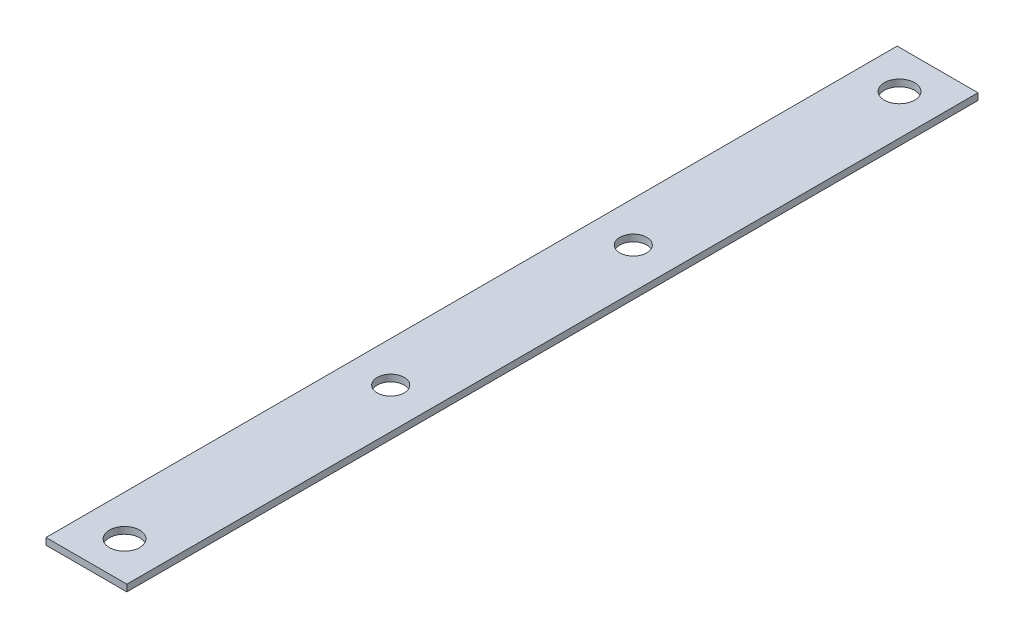
ISO-10303-21;
HEADER;
FILE_DESCRIPTION(('STEP AP214'),'2;1');
FILE_NAME('part.step','',(''),(''),'','','');
FILE_SCHEMA(('AUTOMOTIVE_DESIGN { 1 0 10303 214 1 1 1 1 }'));
ENDSEC;
DATA;
#1=APPLICATION_CONTEXT('core data for automotive mechanical design processes');
#2=APPLICATION_PROTOCOL_DEFINITION('international standard','automotive_design',2000,#1);
#3=PRODUCT_CONTEXT('',#1,'mechanical');
#4=PRODUCT('Part','Part','',(#3));
#5=PRODUCT_RELATED_PRODUCT_CATEGORY('part','',(#4));
#6=PRODUCT_DEFINITION_FORMATION('','',#4);
#7=PRODUCT_DEFINITION_CONTEXT('part definition',#1,'design');
#8=PRODUCT_DEFINITION('design','',#6,#7);
#9=PRODUCT_DEFINITION_SHAPE('','',#8);
#10=(LENGTH_UNIT() NAMED_UNIT(*) SI_UNIT(.MILLI.,.METRE.));
#11=(NAMED_UNIT(*) PLANE_ANGLE_UNIT() SI_UNIT($,.RADIAN.));
#12=(NAMED_UNIT(*) SI_UNIT($,.STERADIAN.) SOLID_ANGLE_UNIT());
#13=UNCERTAINTY_MEASURE_WITH_UNIT(LENGTH_MEASURE(1.E-05),#10,'distance_accuracy_value','');
#14=(GEOMETRIC_REPRESENTATION_CONTEXT(3) GLOBAL_UNCERTAINTY_ASSIGNED_CONTEXT((#13)) GLOBAL_UNIT_ASSIGNED_CONTEXT((#10,
#11,#12)) REPRESENTATION_CONTEXT('',''));
#15=CARTESIAN_POINT('',(0.,0.,0.));
#16=DIRECTION('',(0.,0.,1.));
#17=DIRECTION('',(1.,0.,0.));
#18=AXIS2_PLACEMENT_3D('',#15,#16,#17);
#19=CARTESIAN_POINT('',(0.,0.,401.0152));
#20=DIRECTION('',(1.,0.,0.));
#21=DIRECTION('',(0.,0.,-1.));
#22=AXIS2_PLACEMENT_3D('',#19,#20,#21);
#23=PLANE('',#22);
#24=DIRECTION('',(0.,-1.,0.));
#25=VECTOR('',#24,1.);
#26=CARTESIAN_POINT('',(0.,0.,0.));
#27=LINE('',#26,#25);
#28=CARTESIAN_POINT('',(0.,3.175,0.));
#29=VERTEX_POINT('',#28);
#30=CARTESIAN_POINT('',(0.,0.,0.));
#31=VERTEX_POINT('',#30);
#32=EDGE_CURVE('E95',#29,#31,#27,.T.);
#33=ORIENTED_EDGE('',*,*,#32,.T.);
#34=DIRECTION('',(0.,0.,-1.));
#35=VECTOR('',#34,1.);
#36=CARTESIAN_POINT('',(0.,0.,401.0152));
#37=LINE('',#36,#35);
#38=CARTESIAN_POINT('',(0.,0.,401.0152));
#39=VERTEX_POINT('',#38);
#40=EDGE_CURVE('E11',#39,#31,#37,.T.);
#41=ORIENTED_EDGE('',*,*,#40,.F.);
#42=DIRECTION('',(0.,-1.,0.));
#43=VECTOR('',#42,1.);
#44=CARTESIAN_POINT('',(0.,0.,401.0152));
#45=LINE('',#44,#43);
#46=CARTESIAN_POINT('',(0.,3.175,401.0152));
#47=VERTEX_POINT('',#46);
#48=EDGE_CURVE('E83',#47,#39,#45,.T.);
#49=ORIENTED_EDGE('',*,*,#48,.F.);
#50=DIRECTION('',(0.,0.,-1.));
#51=VECTOR('',#50,1.);
#52=CARTESIAN_POINT('',(0.,3.175,401.0152));
#53=LINE('',#52,#51);
#54=EDGE_CURVE('E91',#47,#29,#53,.T.);
#55=ORIENTED_EDGE('',*,*,#54,.T.);
#56=EDGE_LOOP('',(#33,#41,#49,#55));
#57=FACE_BOUND('',#56,.T.);
#58=ADVANCED_FACE('F32',(#57),#23,.F.);
#59=CARTESIAN_POINT('',(0.,0.,401.0152));
#60=DIRECTION('',(0.,1.,0.));
#61=DIRECTION('',(0.,0.,1.));
#62=AXIS2_PLACEMENT_3D('',#59,#60,#61);
#63=PLANE('',#62);
#64=CARTESIAN_POINT('',(19.05,0.,143.3576));
#65=DIRECTION('',(0.,1.,0.));
#66=DIRECTION('',(0.,0.,1.));
#67=AXIS2_PLACEMENT_3D('',#64,#65,#66);
#68=CIRCLE('',#67,6.34999999999998);
#69=CARTESIAN_POINT('',(19.05,0.,149.7076));
#70=VERTEX_POINT('',#69);
#71=EDGE_CURVE('E124',#70,#70,#68,.T.);
#72=ORIENTED_EDGE('',*,*,#71,.T.);
#73=EDGE_LOOP('',(#72));
#74=FACE_BOUND('',#73,.T.);
#75=CARTESIAN_POINT('',(19.05,0.,257.6576));
#76=DIRECTION('',(0.,1.,0.));
#77=DIRECTION('',(0.,0.,1.));
#78=AXIS2_PLACEMENT_3D('',#75,#76,#77);
#79=CIRCLE('',#78,6.35);
#80=CARTESIAN_POINT('',(19.05,0.,264.0076));
#81=VERTEX_POINT('',#80);
#82=EDGE_CURVE('E118',#81,#81,#79,.T.);
#83=ORIENTED_EDGE('',*,*,#82,.T.);
#84=EDGE_LOOP('',(#83));
#85=FACE_BOUND('',#84,.T.);
#86=CARTESIAN_POINT('',(19.05,0.,17.9451));
#87=DIRECTION('',(0.,1.,0.));
#88=DIRECTION('',(0.,0.,1.));
#89=AXIS2_PLACEMENT_3D('',#86,#87,#88);
#90=CIRCLE('',#89,7.14375);
#91=CARTESIAN_POINT('',(19.05,0.,25.08885));
#92=VERTEX_POINT('',#91);
#93=EDGE_CURVE('E112',#92,#92,#90,.T.);
#94=ORIENTED_EDGE('',*,*,#93,.T.);
#95=EDGE_LOOP('',(#94));
#96=FACE_BOUND('',#95,.T.);
#97=CARTESIAN_POINT('',(19.05,0.,383.0701));
#98=DIRECTION('',(0.,1.,0.));
#99=DIRECTION('',(0.,0.,1.));
#100=AXIS2_PLACEMENT_3D('',#97,#98,#99);
#101=CIRCLE('',#100,7.14375000000003);
#102=CARTESIAN_POINT('',(19.05,0.,390.21385));
#103=VERTEX_POINT('',#102);
#104=EDGE_CURVE('E98',#103,#103,#101,.T.);
#105=ORIENTED_EDGE('',*,*,#104,.T.);
#106=EDGE_LOOP('',(#105));
#107=FACE_BOUND('',#106,.T.);
#108=DIRECTION('',(1.,0.,0.));
#109=VECTOR('',#108,1.);
#110=CARTESIAN_POINT('',(0.,0.,0.));
#111=LINE('',#110,#109);
#112=CARTESIAN_POINT('',(38.1,0.,0.));
#113=VERTEX_POINT('',#112);
#114=EDGE_CURVE('E87',#31,#113,#111,.T.);
#115=ORIENTED_EDGE('',*,*,#114,.T.);
#116=DIRECTION('',(0.,0.,-1.));
#117=VECTOR('',#116,1.);
#118=CARTESIAN_POINT('',(38.1,0.,401.0152));
#119=LINE('',#118,#117);
#120=CARTESIAN_POINT('',(38.1,0.,401.0152));
#121=VERTEX_POINT('',#120);
#122=EDGE_CURVE('E40',#121,#113,#119,.T.);
#123=ORIENTED_EDGE('',*,*,#122,.F.);
#124=DIRECTION('',(1.,0.,0.));
#125=VECTOR('',#124,1.);
#126=CARTESIAN_POINT('',(0.,0.,401.0152));
#127=LINE('',#126,#125);
#128=EDGE_CURVE('E78',#39,#121,#127,.T.);
#129=ORIENTED_EDGE('',*,*,#128,.F.);
#130=ORIENTED_EDGE('',*,*,#40,.T.);
#131=EDGE_LOOP('',(#115,#123,#129,#130));
#132=FACE_BOUND('',#131,.T.);
#133=ADVANCED_FACE('F86',(#74,#85,#96,#107,#132),#63,.F.);
#134=CARTESIAN_POINT('',(38.1,0.,401.0152));
#135=DIRECTION('',(-1.,0.,0.));
#136=DIRECTION('',(0.,0.,1.));
#137=AXIS2_PLACEMENT_3D('',#134,#135,#136);
#138=PLANE('',#137);
#139=DIRECTION('',(0.,1.,0.));
#140=VECTOR('',#139,1.);
#141=CARTESIAN_POINT('',(38.1,0.,0.));
#142=LINE('',#141,#140);
#143=CARTESIAN_POINT('',(38.1,3.175,0.));
#144=VERTEX_POINT('',#143);
#145=EDGE_CURVE('E65',#113,#144,#142,.T.);
#146=ORIENTED_EDGE('',*,*,#145,.T.);
#147=DIRECTION('',(0.,0.,-1.));
#148=VECTOR('',#147,1.);
#149=CARTESIAN_POINT('',(38.1,3.175,401.0152));
#150=LINE('',#149,#148);
#151=CARTESIAN_POINT('',(38.1,3.175,401.0152));
#152=VERTEX_POINT('',#151);
#153=EDGE_CURVE('E88',#152,#144,#150,.T.);
#154=ORIENTED_EDGE('',*,*,#153,.F.);
#155=DIRECTION('',(0.,1.,0.));
#156=VECTOR('',#155,1.);
#157=CARTESIAN_POINT('',(38.1,0.,401.0152));
#158=LINE('',#157,#156);
#159=EDGE_CURVE('E81',#121,#152,#158,.T.);
#160=ORIENTED_EDGE('',*,*,#159,.F.);
#161=ORIENTED_EDGE('',*,*,#122,.T.);
#162=EDGE_LOOP('',(#146,#154,#160,#161));
#163=FACE_BOUND('',#162,.T.);
#164=ADVANCED_FACE('F89',(#163),#138,.F.);
#165=CARTESIAN_POINT('',(0.,3.175,401.0152));
#166=DIRECTION('',(0.,-1.,0.));
#167=DIRECTION('',(0.,0.,-1.));
#168=AXIS2_PLACEMENT_3D('',#165,#166,#167);
#169=PLANE('',#168);
#170=CARTESIAN_POINT('',(19.05,3.175,143.3576));
#171=DIRECTION('',(0.,1.,0.));
#172=DIRECTION('',(0.,0.,1.));
#173=AXIS2_PLACEMENT_3D('',#170,#171,#172);
#174=CIRCLE('',#173,6.34999999999998);
#175=CARTESIAN_POINT('',(19.05,3.175,149.7076));
#176=VERTEX_POINT('',#175);
#177=EDGE_CURVE('E127',#176,#176,#174,.T.);
#178=ORIENTED_EDGE('',*,*,#177,.F.);
#179=EDGE_LOOP('',(#178));
#180=FACE_BOUND('',#179,.T.);
#181=CARTESIAN_POINT('',(19.05,3.175,257.6576));
#182=DIRECTION('',(0.,1.,0.));
#183=DIRECTION('',(0.,0.,1.));
#184=AXIS2_PLACEMENT_3D('',#181,#182,#183);
#185=CIRCLE('',#184,6.35);
#186=CARTESIAN_POINT('',(19.05,3.175,264.0076));
#187=VERTEX_POINT('',#186);
#188=EDGE_CURVE('E121',#187,#187,#185,.T.);
#189=ORIENTED_EDGE('',*,*,#188,.F.);
#190=EDGE_LOOP('',(#189));
#191=FACE_BOUND('',#190,.T.);
#192=CARTESIAN_POINT('',(19.05,3.175,17.9451));
#193=DIRECTION('',(0.,1.,0.));
#194=DIRECTION('',(0.,0.,1.));
#195=AXIS2_PLACEMENT_3D('',#192,#193,#194);
#196=CIRCLE('',#195,7.14375);
#197=CARTESIAN_POINT('',(19.05,3.175,25.08885));
#198=VERTEX_POINT('',#197);
#199=EDGE_CURVE('E115',#198,#198,#196,.T.);
#200=ORIENTED_EDGE('',*,*,#199,.F.);
#201=EDGE_LOOP('',(#200));
#202=FACE_BOUND('',#201,.T.);
#203=CARTESIAN_POINT('',(19.05,3.175,383.0701));
#204=DIRECTION('',(0.,1.,0.));
#205=DIRECTION('',(0.,0.,1.));
#206=AXIS2_PLACEMENT_3D('',#203,#204,#205);
#207=CIRCLE('',#206,7.14375000000003);
#208=CARTESIAN_POINT('',(19.05,3.175,390.21385));
#209=VERTEX_POINT('',#208);
#210=EDGE_CURVE('E109',#209,#209,#207,.T.);
#211=ORIENTED_EDGE('',*,*,#210,.F.);
#212=EDGE_LOOP('',(#211));
#213=FACE_BOUND('',#212,.T.);
#214=DIRECTION('',(-1.,0.,0.));
#215=VECTOR('',#214,1.);
#216=CARTESIAN_POINT('',(0.,3.175,0.));
#217=LINE('',#216,#215);
#218=EDGE_CURVE('E71',#144,#29,#217,.T.);
#219=ORIENTED_EDGE('',*,*,#218,.T.);
#220=ORIENTED_EDGE('',*,*,#54,.F.);
#221=DIRECTION('',(-1.,0.,0.));
#222=VECTOR('',#221,1.);
#223=CARTESIAN_POINT('',(0.,3.175,401.0152));
#224=LINE('',#223,#222);
#225=EDGE_CURVE('E48',#152,#47,#224,.T.);
#226=ORIENTED_EDGE('',*,*,#225,.F.);
#227=ORIENTED_EDGE('',*,*,#153,.T.);
#228=EDGE_LOOP('',(#219,#220,#226,#227));
#229=FACE_BOUND('',#228,.T.);
#230=ADVANCED_FACE('F103',(#180,#191,#202,#213,#229),#169,.F.);
#231=CARTESIAN_POINT('',(0.,0.,401.0152));
#232=DIRECTION('',(0.,0.,-1.));
#233=DIRECTION('',(-1.,0.,0.));
#234=AXIS2_PLACEMENT_3D('',#231,#232,#233);
#235=PLANE('',#234);
#236=ORIENTED_EDGE('',*,*,#48,.T.);
#237=ORIENTED_EDGE('',*,*,#128,.T.);
#238=ORIENTED_EDGE('',*,*,#159,.T.);
#239=ORIENTED_EDGE('',*,*,#225,.T.);
#240=EDGE_LOOP('',(#236,#237,#238,#239));
#241=FACE_BOUND('',#240,.T.);
#242=ADVANCED_FACE('F79',(#241),#235,.F.);
#243=CARTESIAN_POINT('',(0.,0.,0.));
#244=DIRECTION('',(0.,0.,-1.));
#245=DIRECTION('',(-1.,0.,0.));
#246=AXIS2_PLACEMENT_3D('',#243,#244,#245);
#247=PLANE('',#246);
#248=ORIENTED_EDGE('',*,*,#32,.F.);
#249=ORIENTED_EDGE('',*,*,#218,.F.);
#250=ORIENTED_EDGE('',*,*,#145,.F.);
#251=ORIENTED_EDGE('',*,*,#114,.F.);
#252=EDGE_LOOP('',(#248,#249,#250,#251));
#253=FACE_BOUND('',#252,.T.);
#254=ADVANCED_FACE('F106',(#253),#247,.T.);
#255=CARTESIAN_POINT('',(19.05,0.,383.0701));
#256=DIRECTION('',(0.,1.,0.));
#257=DIRECTION('',(0.,0.,1.));
#258=AXIS2_PLACEMENT_3D('',#255,#256,#257);
#259=CYLINDRICAL_SURFACE('',#258,7.14375000000003);
#260=ORIENTED_EDGE('',*,*,#104,.F.);
#261=EDGE_LOOP('',(#260));
#262=FACE_BOUND('',#261,.T.);
#263=ORIENTED_EDGE('',*,*,#210,.T.);
#264=EDGE_LOOP('',(#263));
#265=FACE_BOUND('',#264,.T.);
#266=ADVANCED_FACE('F151',(#262,#265),#259,.F.);
#267=CARTESIAN_POINT('',(19.05,0.,17.9451));
#268=DIRECTION('',(0.,1.,0.));
#269=DIRECTION('',(0.,0.,1.));
#270=AXIS2_PLACEMENT_3D('',#267,#268,#269);
#271=CYLINDRICAL_SURFACE('',#270,7.14375);
#272=ORIENTED_EDGE('',*,*,#93,.F.);
#273=EDGE_LOOP('',(#272));
#274=FACE_BOUND('',#273,.T.);
#275=ORIENTED_EDGE('',*,*,#199,.T.);
#276=EDGE_LOOP('',(#275));
#277=FACE_BOUND('',#276,.T.);
#278=ADVANCED_FACE('F153',(#274,#277),#271,.F.);
#279=CARTESIAN_POINT('',(19.05,0.,257.6576));
#280=DIRECTION('',(0.,1.,0.));
#281=DIRECTION('',(0.,0.,1.));
#282=AXIS2_PLACEMENT_3D('',#279,#280,#281);
#283=CYLINDRICAL_SURFACE('',#282,6.35);
#284=ORIENTED_EDGE('',*,*,#82,.F.);
#285=EDGE_LOOP('',(#284));
#286=FACE_BOUND('',#285,.T.);
#287=ORIENTED_EDGE('',*,*,#188,.T.);
#288=EDGE_LOOP('',(#287));
#289=FACE_BOUND('',#288,.T.);
#290=ADVANCED_FACE('F138',(#286,#289),#283,.F.);
#291=CARTESIAN_POINT('',(19.05,0.,143.3576));
#292=DIRECTION('',(0.,1.,0.));
#293=DIRECTION('',(0.,0.,1.));
#294=AXIS2_PLACEMENT_3D('',#291,#292,#293);
#295=CYLINDRICAL_SURFACE('',#294,6.34999999999998);
#296=ORIENTED_EDGE('',*,*,#71,.F.);
#297=EDGE_LOOP('',(#296));
#298=FACE_BOUND('',#297,.T.);
#299=ORIENTED_EDGE('',*,*,#177,.T.);
#300=EDGE_LOOP('',(#299));
#301=FACE_BOUND('',#300,.T.);
#302=ADVANCED_FACE('F135',(#298,#301),#295,.F.);
#303=CLOSED_SHELL('',(#58,#133,#164,#230,#242,#254,#266,#278,#290,#302));
#304=MANIFOLD_SOLID_BREP('B2',#303);
#305=ADVANCED_BREP_SHAPE_REPRESENTATION('',(#18,#304),#14);
#306=SHAPE_DEFINITION_REPRESENTATION(#9,#305);
ENDSEC;
END-ISO-10303-21;
